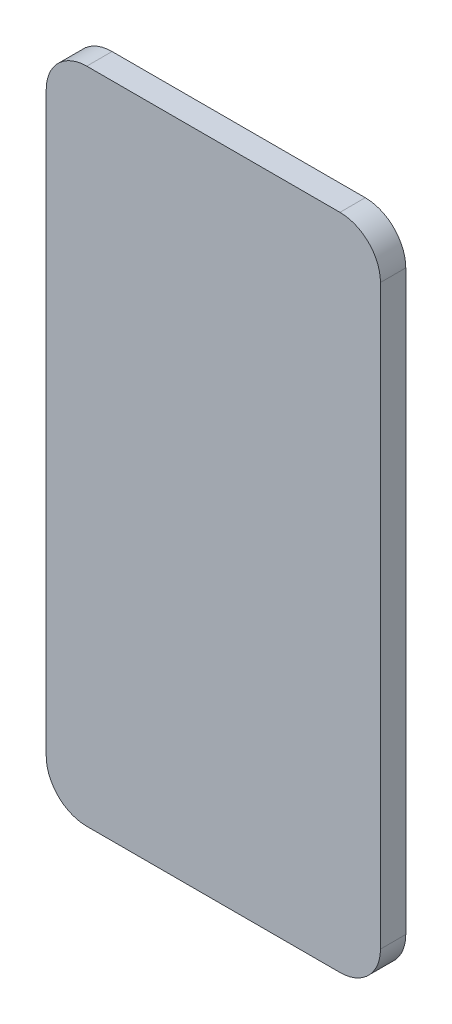
ISO-10303-21;
HEADER;
FILE_DESCRIPTION(('STEP AP214'),'2;1');
FILE_NAME('part.step','',(''),(''),'','','');
FILE_SCHEMA(('AUTOMOTIVE_DESIGN { 1 0 10303 214 1 1 1 1 }'));
ENDSEC;
DATA;
#1=APPLICATION_CONTEXT('core data for automotive mechanical design processes');
#2=APPLICATION_PROTOCOL_DEFINITION('international standard','automotive_design',2000,#1);
#3=PRODUCT_CONTEXT('',#1,'mechanical');
#4=PRODUCT('Part','Part','',(#3));
#5=PRODUCT_RELATED_PRODUCT_CATEGORY('part','',(#4));
#6=PRODUCT_DEFINITION_FORMATION('','',#4);
#7=PRODUCT_DEFINITION_CONTEXT('part definition',#1,'design');
#8=PRODUCT_DEFINITION('design','',#6,#7);
#9=PRODUCT_DEFINITION_SHAPE('','',#8);
#10=(LENGTH_UNIT() NAMED_UNIT(*) SI_UNIT(.MILLI.,.METRE.));
#11=(NAMED_UNIT(*) PLANE_ANGLE_UNIT() SI_UNIT($,.RADIAN.));
#12=(NAMED_UNIT(*) SI_UNIT($,.STERADIAN.) SOLID_ANGLE_UNIT());
#13=UNCERTAINTY_MEASURE_WITH_UNIT(LENGTH_MEASURE(1.E-05),#10,'distance_accuracy_value','');
#14=(GEOMETRIC_REPRESENTATION_CONTEXT(3) GLOBAL_UNCERTAINTY_ASSIGNED_CONTEXT((#13)) GLOBAL_UNIT_ASSIGNED_CONTEXT((#10,
#11,#12)) REPRESENTATION_CONTEXT('',''));
#15=CARTESIAN_POINT('',(0.,0.,0.));
#16=DIRECTION('',(0.,0.,1.));
#17=DIRECTION('',(1.,0.,0.));
#18=AXIS2_PLACEMENT_3D('',#15,#16,#17);
#19=CARTESIAN_POINT('',(-25.,-57.,5.));
#20=DIRECTION('',(0.,0.,-1.));
#21=DIRECTION('',(-1.,0.,0.));
#22=AXIS2_PLACEMENT_3D('',#19,#20,#21);
#23=CYLINDRICAL_SURFACE('',#22,8.);
#24=CARTESIAN_POINT('',(-25.,-57.,0.));
#25=DIRECTION('',(0.,0.,1.));
#26=DIRECTION('',(1.,0.,0.));
#27=AXIS2_PLACEMENT_3D('',#24,#25,#26);
#28=CIRCLE('',#27,8.);
#29=CARTESIAN_POINT('',(-33.,-57.,0.));
#30=VERTEX_POINT('',#29);
#31=CARTESIAN_POINT('',(-25.,-65.,0.));
#32=VERTEX_POINT('',#31);
#33=EDGE_CURVE('E150',#30,#32,#28,.T.);
#34=ORIENTED_EDGE('',*,*,#33,.T.);
#35=DIRECTION('',(0.,0.,-1.));
#36=VECTOR('',#35,1.);
#37=CARTESIAN_POINT('',(-25.,-65.,5.));
#38=LINE('',#37,#36);
#39=CARTESIAN_POINT('',(-25.,-65.,5.));
#40=VERTEX_POINT('',#39);
#41=EDGE_CURVE('E11',#40,#32,#38,.T.);
#42=ORIENTED_EDGE('',*,*,#41,.F.);
#43=CARTESIAN_POINT('',(-25.,-57.,5.));
#44=DIRECTION('',(0.,0.,1.));
#45=DIRECTION('',(1.,0.,0.));
#46=AXIS2_PLACEMENT_3D('',#43,#44,#45);
#47=CIRCLE('',#46,8.);
#48=CARTESIAN_POINT('',(-33.,-57.,5.));
#49=VERTEX_POINT('',#48);
#50=EDGE_CURVE('E172',#49,#40,#47,.T.);
#51=ORIENTED_EDGE('',*,*,#50,.F.);
#52=DIRECTION('',(0.,0.,-1.));
#53=VECTOR('',#52,1.);
#54=CARTESIAN_POINT('',(-33.,-57.,5.));
#55=LINE('',#54,#53);
#56=EDGE_CURVE('E146',#49,#30,#55,.T.);
#57=ORIENTED_EDGE('',*,*,#56,.T.);
#58=EDGE_LOOP('',(#34,#42,#51,#57));
#59=FACE_BOUND('',#58,.T.);
#60=ADVANCED_FACE('F49',(#59),#23,.T.);
#61=CARTESIAN_POINT('',(25.,-65.,5.));
#62=DIRECTION('',(0.,1.,0.));
#63=DIRECTION('',(0.,0.,1.));
#64=AXIS2_PLACEMENT_3D('',#61,#62,#63);
#65=PLANE('',#64);
#66=DIRECTION('',(1.,0.,0.));
#67=VECTOR('',#66,1.);
#68=CARTESIAN_POINT('',(25.,-65.,0.));
#69=LINE('',#68,#67);
#70=CARTESIAN_POINT('',(25.,-65.,0.));
#71=VERTEX_POINT('',#70);
#72=EDGE_CURVE('E154',#32,#71,#69,.T.);
#73=ORIENTED_EDGE('',*,*,#72,.T.);
#74=DIRECTION('',(0.,0.,-1.));
#75=VECTOR('',#74,1.);
#76=CARTESIAN_POINT('',(25.,-65.,5.));
#77=LINE('',#76,#75);
#78=CARTESIAN_POINT('',(25.,-65.,5.));
#79=VERTEX_POINT('',#78);
#80=EDGE_CURVE('E58',#79,#71,#77,.T.);
#81=ORIENTED_EDGE('',*,*,#80,.F.);
#82=DIRECTION('',(1.,0.,0.));
#83=VECTOR('',#82,1.);
#84=CARTESIAN_POINT('',(25.,-65.,5.));
#85=LINE('',#84,#83);
#86=EDGE_CURVE('E109',#40,#79,#85,.T.);
#87=ORIENTED_EDGE('',*,*,#86,.F.);
#88=ORIENTED_EDGE('',*,*,#41,.T.);
#89=EDGE_LOOP('',(#73,#81,#87,#88));
#90=FACE_BOUND('',#89,.T.);
#91=ADVANCED_FACE('F218',(#90),#65,.F.);
#92=CARTESIAN_POINT('',(25.,-57.,5.));
#93=DIRECTION('',(0.,0.,-1.));
#94=DIRECTION('',(-1.,0.,0.));
#95=AXIS2_PLACEMENT_3D('',#92,#93,#94);
#96=CYLINDRICAL_SURFACE('',#95,8.);
#97=CARTESIAN_POINT('',(25.,-57.,0.));
#98=DIRECTION('',(0.,0.,1.));
#99=DIRECTION('',(1.,0.,0.));
#100=AXIS2_PLACEMENT_3D('',#97,#98,#99);
#101=CIRCLE('',#100,8.);
#102=CARTESIAN_POINT('',(33.,-57.,0.));
#103=VERTEX_POINT('',#102);
#104=EDGE_CURVE('E157',#71,#103,#101,.T.);
#105=ORIENTED_EDGE('',*,*,#104,.T.);
#106=DIRECTION('',(0.,0.,-1.));
#107=VECTOR('',#106,1.);
#108=CARTESIAN_POINT('',(33.,-57.,5.));
#109=LINE('',#108,#107);
#110=CARTESIAN_POINT('',(33.,-57.,5.));
#111=VERTEX_POINT('',#110);
#112=EDGE_CURVE('E183',#111,#103,#109,.T.);
#113=ORIENTED_EDGE('',*,*,#112,.F.);
#114=CARTESIAN_POINT('',(25.,-57.,5.));
#115=DIRECTION('',(0.,0.,1.));
#116=DIRECTION('',(1.,0.,0.));
#117=AXIS2_PLACEMENT_3D('',#114,#115,#116);
#118=CIRCLE('',#117,8.);
#119=EDGE_CURVE('E193',#79,#111,#118,.T.);
#120=ORIENTED_EDGE('',*,*,#119,.F.);
#121=ORIENTED_EDGE('',*,*,#80,.T.);
#122=EDGE_LOOP('',(#105,#113,#120,#121));
#123=FACE_BOUND('',#122,.T.);
#124=ADVANCED_FACE('F191',(#123),#96,.T.);
#125=CARTESIAN_POINT('',(33.,57.,5.));
#126=DIRECTION('',(-1.,0.,0.));
#127=DIRECTION('',(0.,-1.,0.));
#128=AXIS2_PLACEMENT_3D('',#125,#126,#127);
#129=PLANE('',#128);
#130=DIRECTION('',(0.,1.,0.));
#131=VECTOR('',#130,1.);
#132=CARTESIAN_POINT('',(33.,57.,0.));
#133=LINE('',#132,#131);
#134=CARTESIAN_POINT('',(33.,57.,0.));
#135=VERTEX_POINT('',#134);
#136=EDGE_CURVE('E160',#103,#135,#133,.T.);
#137=ORIENTED_EDGE('',*,*,#136,.T.);
#138=DIRECTION('',(0.,0.,-1.));
#139=VECTOR('',#138,1.);
#140=CARTESIAN_POINT('',(33.,57.,5.));
#141=LINE('',#140,#139);
#142=CARTESIAN_POINT('',(33.,57.,5.));
#143=VERTEX_POINT('',#142);
#144=EDGE_CURVE('E179',#143,#135,#141,.T.);
#145=ORIENTED_EDGE('',*,*,#144,.F.);
#146=DIRECTION('',(0.,1.,0.));
#147=VECTOR('',#146,1.);
#148=CARTESIAN_POINT('',(33.,57.,5.));
#149=LINE('',#148,#147);
#150=EDGE_CURVE('E206',#111,#143,#149,.T.);
#151=ORIENTED_EDGE('',*,*,#150,.F.);
#152=ORIENTED_EDGE('',*,*,#112,.T.);
#153=EDGE_LOOP('',(#137,#145,#151,#152));
#154=FACE_BOUND('',#153,.T.);
#155=ADVANCED_FACE('F201',(#154),#129,.F.);
#156=CARTESIAN_POINT('',(25.,57.,5.));
#157=DIRECTION('',(0.,0.,-1.));
#158=DIRECTION('',(-1.,0.,0.));
#159=AXIS2_PLACEMENT_3D('',#156,#157,#158);
#160=CYLINDRICAL_SURFACE('',#159,8.);
#161=CARTESIAN_POINT('',(25.,57.,0.));
#162=DIRECTION('',(0.,0.,1.));
#163=DIRECTION('',(1.,0.,0.));
#164=AXIS2_PLACEMENT_3D('',#161,#162,#163);
#165=CIRCLE('',#164,8.);
#166=CARTESIAN_POINT('',(25.,65.,0.));
#167=VERTEX_POINT('',#166);
#168=EDGE_CURVE('E163',#135,#167,#165,.T.);
#169=ORIENTED_EDGE('',*,*,#168,.T.);
#170=DIRECTION('',(0.,0.,-1.));
#171=VECTOR('',#170,1.);
#172=CARTESIAN_POINT('',(25.,65.,5.));
#173=LINE('',#172,#171);
#174=CARTESIAN_POINT('',(25.,65.,5.));
#175=VERTEX_POINT('',#174);
#176=EDGE_CURVE('E139',#175,#167,#173,.T.);
#177=ORIENTED_EDGE('',*,*,#176,.F.);
#178=CARTESIAN_POINT('',(25.,57.,5.));
#179=DIRECTION('',(0.,0.,1.));
#180=DIRECTION('',(1.,0.,0.));
#181=AXIS2_PLACEMENT_3D('',#178,#179,#180);
#182=CIRCLE('',#181,8.);
#183=EDGE_CURVE('E128',#143,#175,#182,.T.);
#184=ORIENTED_EDGE('',*,*,#183,.F.);
#185=ORIENTED_EDGE('',*,*,#144,.T.);
#186=EDGE_LOOP('',(#169,#177,#184,#185));
#187=FACE_BOUND('',#186,.T.);
#188=ADVANCED_FACE('F204',(#187),#160,.T.);
#189=CARTESIAN_POINT('',(25.,65.,5.));
#190=DIRECTION('',(0.,-1.,0.));
#191=DIRECTION('',(0.,0.,-1.));
#192=AXIS2_PLACEMENT_3D('',#189,#190,#191);
#193=PLANE('',#192);
#194=DIRECTION('',(-1.,0.,0.));
#195=VECTOR('',#194,1.);
#196=CARTESIAN_POINT('',(25.,65.,0.));
#197=LINE('',#196,#195);
#198=CARTESIAN_POINT('',(-25.,65.,0.));
#199=VERTEX_POINT('',#198);
#200=EDGE_CURVE('E137',#167,#199,#197,.T.);
#201=ORIENTED_EDGE('',*,*,#200,.T.);
#202=DIRECTION('',(0.,0.,-1.));
#203=VECTOR('',#202,1.);
#204=CARTESIAN_POINT('',(-25.,65.,5.));
#205=LINE('',#204,#203);
#206=CARTESIAN_POINT('',(-25.,65.,5.));
#207=VERTEX_POINT('',#206);
#208=EDGE_CURVE('E134',#207,#199,#205,.T.);
#209=ORIENTED_EDGE('',*,*,#208,.F.);
#210=DIRECTION('',(-1.,0.,0.));
#211=VECTOR('',#210,1.);
#212=CARTESIAN_POINT('',(25.,65.,5.));
#213=LINE('',#212,#211);
#214=EDGE_CURVE('E122',#175,#207,#213,.T.);
#215=ORIENTED_EDGE('',*,*,#214,.F.);
#216=ORIENTED_EDGE('',*,*,#176,.T.);
#217=EDGE_LOOP('',(#201,#209,#215,#216));
#218=FACE_BOUND('',#217,.T.);
#219=ADVANCED_FACE('F135',(#218),#193,.F.);
#220=CARTESIAN_POINT('',(-25.,57.,5.));
#221=DIRECTION('',(0.,0.,-1.));
#222=DIRECTION('',(-1.,0.,0.));
#223=AXIS2_PLACEMENT_3D('',#220,#221,#222);
#224=CYLINDRICAL_SURFACE('',#223,8.);
#225=CARTESIAN_POINT('',(-25.,57.,0.));
#226=DIRECTION('',(0.,0.,1.));
#227=DIRECTION('',(-1.,0.,0.));
#228=AXIS2_PLACEMENT_3D('',#225,#226,#227);
#229=CIRCLE('',#228,8.);
#230=CARTESIAN_POINT('',(-33.,57.,0.));
#231=VERTEX_POINT('',#230);
#232=EDGE_CURVE('E95',#199,#231,#229,.T.);
#233=ORIENTED_EDGE('',*,*,#232,.T.);
#234=DIRECTION('',(0.,0.,-1.));
#235=VECTOR('',#234,1.);
#236=CARTESIAN_POINT('',(-33.,57.,5.));
#237=LINE('',#236,#235);
#238=CARTESIAN_POINT('',(-33.,57.,5.));
#239=VERTEX_POINT('',#238);
#240=EDGE_CURVE('E140',#239,#231,#237,.T.);
#241=ORIENTED_EDGE('',*,*,#240,.F.);
#242=CARTESIAN_POINT('',(-25.,57.,5.));
#243=DIRECTION('',(0.,0.,1.));
#244=DIRECTION('',(-1.,0.,0.));
#245=AXIS2_PLACEMENT_3D('',#242,#243,#244);
#246=CIRCLE('',#245,8.);
#247=EDGE_CURVE('E126',#207,#239,#246,.T.);
#248=ORIENTED_EDGE('',*,*,#247,.F.);
#249=ORIENTED_EDGE('',*,*,#208,.T.);
#250=EDGE_LOOP('',(#233,#241,#248,#249));
#251=FACE_BOUND('',#250,.T.);
#252=ADVANCED_FACE('F142',(#251),#224,.T.);
#253=CARTESIAN_POINT('',(-33.,57.,5.));
#254=DIRECTION('',(1.,0.,0.));
#255=DIRECTION('',(0.,0.,-1.));
#256=AXIS2_PLACEMENT_3D('',#253,#254,#255);
#257=PLANE('',#256);
#258=DIRECTION('',(0.,-1.,0.));
#259=VECTOR('',#258,1.);
#260=CARTESIAN_POINT('',(-33.,57.,0.));
#261=LINE('',#260,#259);
#262=EDGE_CURVE('E101',#231,#30,#261,.T.);
#263=ORIENTED_EDGE('',*,*,#262,.T.);
#264=ORIENTED_EDGE('',*,*,#56,.F.);
#265=DIRECTION('',(0.,-1.,0.));
#266=VECTOR('',#265,1.);
#267=CARTESIAN_POINT('',(-33.,57.,5.));
#268=LINE('',#267,#266);
#269=EDGE_CURVE('E66',#239,#49,#268,.T.);
#270=ORIENTED_EDGE('',*,*,#269,.F.);
#271=ORIENTED_EDGE('',*,*,#240,.T.);
#272=EDGE_LOOP('',(#263,#264,#270,#271));
#273=FACE_BOUND('',#272,.T.);
#274=ADVANCED_FACE('F234',(#273),#257,.F.);
#275=CARTESIAN_POINT('',(-25.,-57.,5.));
#276=DIRECTION('',(0.,0.,1.));
#277=DIRECTION('',(1.,0.,0.));
#278=AXIS2_PLACEMENT_3D('',#275,#276,#277);
#279=PLANE('',#278);
#280=ORIENTED_EDGE('',*,*,#50,.T.);
#281=ORIENTED_EDGE('',*,*,#86,.T.);
#282=ORIENTED_EDGE('',*,*,#119,.T.);
#283=ORIENTED_EDGE('',*,*,#150,.T.);
#284=ORIENTED_EDGE('',*,*,#183,.T.);
#285=ORIENTED_EDGE('',*,*,#214,.T.);
#286=ORIENTED_EDGE('',*,*,#247,.T.);
#287=ORIENTED_EDGE('',*,*,#269,.T.);
#288=EDGE_LOOP('',(#280,#281,#282,#283,#284,#285,#286,#287));
#289=FACE_BOUND('',#288,.T.);
#290=ADVANCED_FACE('F124',(#289),#279,.T.);
#291=CARTESIAN_POINT('',(-25.,-57.,0.));
#292=DIRECTION('',(0.,0.,1.));
#293=DIRECTION('',(1.,0.,0.));
#294=AXIS2_PLACEMENT_3D('',#291,#292,#293);
#295=PLANE('',#294);
#296=ORIENTED_EDGE('',*,*,#33,.F.);
#297=ORIENTED_EDGE('',*,*,#262,.F.);
#298=ORIENTED_EDGE('',*,*,#232,.F.);
#299=ORIENTED_EDGE('',*,*,#200,.F.);
#300=ORIENTED_EDGE('',*,*,#168,.F.);
#301=ORIENTED_EDGE('',*,*,#136,.F.);
#302=ORIENTED_EDGE('',*,*,#104,.F.);
#303=ORIENTED_EDGE('',*,*,#72,.F.);
#304=EDGE_LOOP('',(#296,#297,#298,#299,#300,#301,#302,#303));
#305=FACE_BOUND('',#304,.T.);
#306=ADVANCED_FACE('F197',(#305),#295,.F.);
#307=CLOSED_SHELL('',(#60,#91,#124,#155,#188,#219,#252,#274,#290,#306));
#308=MANIFOLD_SOLID_BREP('B2',#307);
#309=ADVANCED_BREP_SHAPE_REPRESENTATION('',(#18,#308),#14);
#310=SHAPE_DEFINITION_REPRESENTATION(#9,#309);
ENDSEC;
END-ISO-10303-21;
